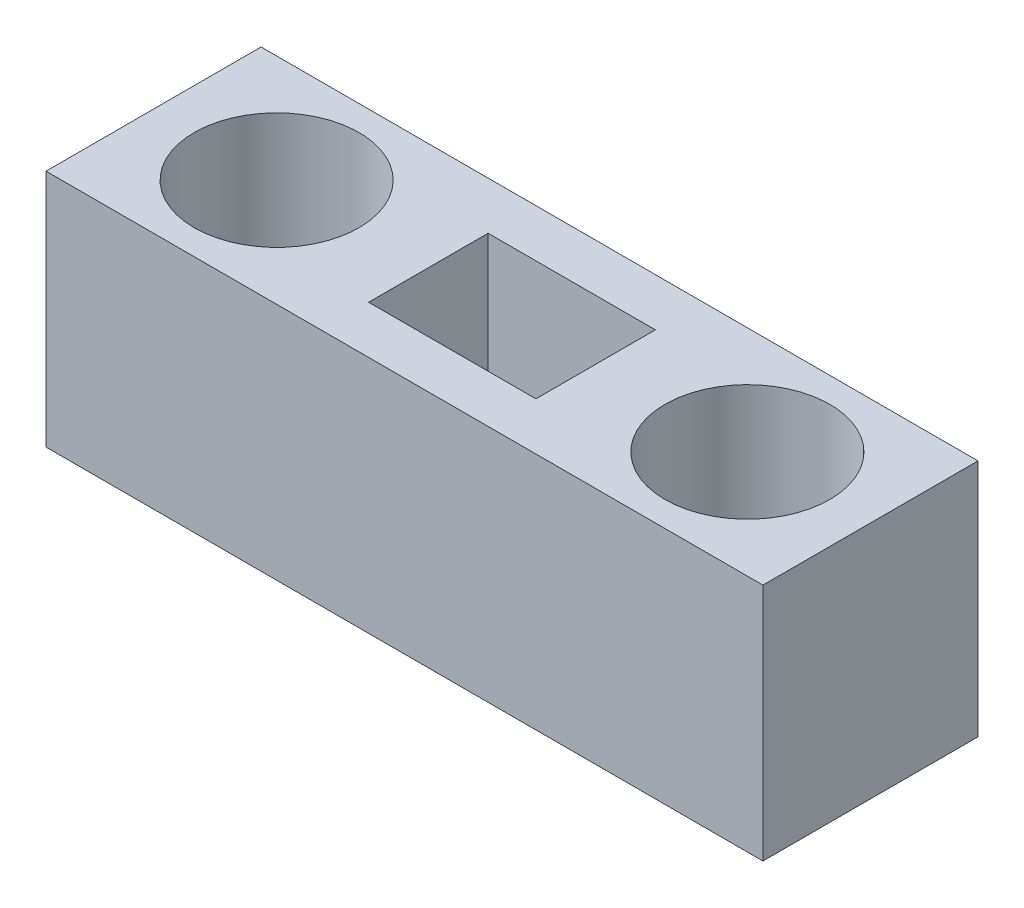
ISO-10303-21;
HEADER;
FILE_DESCRIPTION(('STEP AP214'),'2;1');
FILE_NAME('part.step','',(''),(''),'','','');
FILE_SCHEMA(('AUTOMOTIVE_DESIGN { 1 0 10303 214 1 1 1 1 }'));
ENDSEC;
DATA;
#1=APPLICATION_CONTEXT('core data for automotive mechanical design processes');
#2=APPLICATION_PROTOCOL_DEFINITION('international standard','automotive_design',2000,#1);
#3=PRODUCT_CONTEXT('',#1,'mechanical');
#4=PRODUCT('Part','Part','',(#3));
#5=PRODUCT_RELATED_PRODUCT_CATEGORY('part','',(#4));
#6=PRODUCT_DEFINITION_FORMATION('','',#4);
#7=PRODUCT_DEFINITION_CONTEXT('part definition',#1,'design');
#8=PRODUCT_DEFINITION('design','',#6,#7);
#9=PRODUCT_DEFINITION_SHAPE('','',#8);
#10=(LENGTH_UNIT() NAMED_UNIT(*) SI_UNIT(.MILLI.,.METRE.));
#11=(NAMED_UNIT(*) PLANE_ANGLE_UNIT() SI_UNIT($,.RADIAN.));
#12=(NAMED_UNIT(*) SI_UNIT($,.STERADIAN.) SOLID_ANGLE_UNIT());
#13=UNCERTAINTY_MEASURE_WITH_UNIT(LENGTH_MEASURE(1.E-05),#10,'distance_accuracy_value','');
#14=(GEOMETRIC_REPRESENTATION_CONTEXT(3) GLOBAL_UNCERTAINTY_ASSIGNED_CONTEXT((#13)) GLOBAL_UNIT_ASSIGNED_CONTEXT((#10,
#11,#12)) REPRESENTATION_CONTEXT('',''));
#15=CARTESIAN_POINT('',(0.,0.,0.));
#16=DIRECTION('',(0.,0.,1.));
#17=DIRECTION('',(1.,0.,0.));
#18=AXIS2_PLACEMENT_3D('',#15,#16,#17);
#19=CARTESIAN_POINT('',(0.,10.,0.));
#20=DIRECTION('',(0.,-1.,0.));
#21=DIRECTION('',(0.,0.,-1.));
#22=AXIS2_PLACEMENT_3D('',#19,#20,#21);
#23=PLANE('',#22);
#24=CARTESIAN_POINT('',(9.85,10.,0.));
#25=DIRECTION('',(0.,1.,0.));
#26=DIRECTION('',(0.,0.,1.));
#27=AXIS2_PLACEMENT_3D('',#24,#25,#26);
#28=CIRCLE('',#27,3.45);
#29=CARTESIAN_POINT('',(9.85,10.,3.45));
#30=VERTEX_POINT('',#29);
#31=EDGE_CURVE('E138',#30,#30,#28,.T.);
#32=ORIENTED_EDGE('',*,*,#31,.F.);
#33=EDGE_LOOP('',(#32));
#34=FACE_BOUND('',#33,.T.);
#35=CARTESIAN_POINT('',(-9.85,10.,0.));
#36=DIRECTION('',(0.,1.,0.));
#37=DIRECTION('',(0.,0.,1.));
#38=AXIS2_PLACEMENT_3D('',#35,#36,#37);
#39=CIRCLE('',#38,3.45);
#40=CARTESIAN_POINT('',(-9.85,10.,3.45));
#41=VERTEX_POINT('',#40);
#42=EDGE_CURVE('E144',#41,#41,#39,.T.);
#43=ORIENTED_EDGE('',*,*,#42,.F.);
#44=EDGE_LOOP('',(#43));
#45=FACE_BOUND('',#44,.T.);
#46=DIRECTION('',(0.,0.,-1.));
#47=VECTOR('',#46,1.);
#48=CARTESIAN_POINT('',(15.,10.,4.5));
#49=LINE('',#48,#47);
#50=CARTESIAN_POINT('',(15.,10.,4.5));
#51=VERTEX_POINT('',#50);
#52=CARTESIAN_POINT('',(15.,10.,-4.5));
#53=VERTEX_POINT('',#52);
#54=EDGE_CURVE('E150',#51,#53,#49,.T.);
#55=ORIENTED_EDGE('',*,*,#54,.T.);
#56=DIRECTION('',(-1.,0.,0.));
#57=VECTOR('',#56,1.);
#58=CARTESIAN_POINT('',(-15.,10.,-4.5));
#59=LINE('',#58,#57);
#60=CARTESIAN_POINT('',(-15.,10.,-4.5));
#61=VERTEX_POINT('',#60);
#62=EDGE_CURVE('E153',#53,#61,#59,.T.);
#63=ORIENTED_EDGE('',*,*,#62,.T.);
#64=DIRECTION('',(0.,0.,1.));
#65=VECTOR('',#64,1.);
#66=CARTESIAN_POINT('',(-15.,10.,4.5));
#67=LINE('',#66,#65);
#68=CARTESIAN_POINT('',(-15.,10.,4.5));
#69=VERTEX_POINT('',#68);
#70=EDGE_CURVE('E156',#61,#69,#67,.T.);
#71=ORIENTED_EDGE('',*,*,#70,.T.);
#72=DIRECTION('',(1.,0.,0.));
#73=VECTOR('',#72,1.);
#74=CARTESIAN_POINT('',(-15.,10.,4.5));
#75=LINE('',#74,#73);
#76=EDGE_CURVE('E158',#69,#51,#75,.T.);
#77=ORIENTED_EDGE('',*,*,#76,.T.);
#78=EDGE_LOOP('',(#55,#63,#71,#77));
#79=FACE_BOUND('',#78,.T.);
#80=DIRECTION('',(0.,0.,-1.));
#81=VECTOR('',#80,1.);
#82=CARTESIAN_POINT('',(3.5,10.,2.5));
#83=LINE('',#82,#81);
#84=CARTESIAN_POINT('',(3.5,10.,2.5));
#85=VERTEX_POINT('',#84);
#86=CARTESIAN_POINT('',(3.5,10.,-2.5));
#87=VERTEX_POINT('',#86);
#88=EDGE_CURVE('E102',#85,#87,#83,.T.);
#89=ORIENTED_EDGE('',*,*,#88,.F.);
#90=DIRECTION('',(1.,0.,0.));
#91=VECTOR('',#90,1.);
#92=CARTESIAN_POINT('',(-3.5,10.,2.5));
#93=LINE('',#92,#91);
#94=CARTESIAN_POINT('',(-3.5,10.,2.5));
#95=VERTEX_POINT('',#94);
#96=EDGE_CURVE('E124',#95,#85,#93,.T.);
#97=ORIENTED_EDGE('',*,*,#96,.F.);
#98=DIRECTION('',(0.,0.,1.));
#99=VECTOR('',#98,1.);
#100=CARTESIAN_POINT('',(-3.5,10.,2.5));
#101=LINE('',#100,#99);
#102=CARTESIAN_POINT('',(-3.5,10.,-2.5));
#103=VERTEX_POINT('',#102);
#104=EDGE_CURVE('E122',#103,#95,#101,.T.);
#105=ORIENTED_EDGE('',*,*,#104,.F.);
#106=DIRECTION('',(-1.,0.,0.));
#107=VECTOR('',#106,1.);
#108=CARTESIAN_POINT('',(-3.5,10.,-2.5));
#109=LINE('',#108,#107);
#110=EDGE_CURVE('E110',#87,#103,#109,.T.);
#111=ORIENTED_EDGE('',*,*,#110,.F.);
#112=EDGE_LOOP('',(#89,#97,#105,#111));
#113=FACE_BOUND('',#112,.T.);
#114=ADVANCED_FACE('F37',(#34,#45,#79,#113),#23,.F.);
#115=CARTESIAN_POINT('',(0.,0.,0.));
#116=DIRECTION('',(0.,-1.,0.));
#117=DIRECTION('',(0.,0.,-1.));
#118=AXIS2_PLACEMENT_3D('',#115,#116,#117);
#119=PLANE('',#118);
#120=CARTESIAN_POINT('',(-9.85,0.,0.));
#121=DIRECTION('',(0.,1.,0.));
#122=DIRECTION('',(0.,0.,1.));
#123=AXIS2_PLACEMENT_3D('',#120,#121,#122);
#124=CIRCLE('',#123,3.45);
#125=CARTESIAN_POINT('',(-9.85,0.,3.45));
#126=VERTEX_POINT('',#125);
#127=EDGE_CURVE('E141',#126,#126,#124,.T.);
#128=ORIENTED_EDGE('',*,*,#127,.T.);
#129=EDGE_LOOP('',(#128));
#130=FACE_BOUND('',#129,.T.);
#131=DIRECTION('',(0.,0.,-1.));
#132=VECTOR('',#131,1.);
#133=CARTESIAN_POINT('',(15.,0.,4.5));
#134=LINE('',#133,#132);
#135=CARTESIAN_POINT('',(15.,0.,4.5));
#136=VERTEX_POINT('',#135);
#137=CARTESIAN_POINT('',(15.,0.,-4.5));
#138=VERTEX_POINT('',#137);
#139=EDGE_CURVE('E147',#136,#138,#134,.T.);
#140=ORIENTED_EDGE('',*,*,#139,.F.);
#141=DIRECTION('',(1.,0.,0.));
#142=VECTOR('',#141,1.);
#143=CARTESIAN_POINT('',(-15.,0.,4.5));
#144=LINE('',#143,#142);
#145=CARTESIAN_POINT('',(-15.,0.,4.5));
#146=VERTEX_POINT('',#145);
#147=EDGE_CURVE('E154',#146,#136,#144,.T.);
#148=ORIENTED_EDGE('',*,*,#147,.F.);
#149=DIRECTION('',(0.,0.,1.));
#150=VECTOR('',#149,1.);
#151=CARTESIAN_POINT('',(-15.,0.,4.5));
#152=LINE('',#151,#150);
#153=CARTESIAN_POINT('',(-15.,0.,-4.5));
#154=VERTEX_POINT('',#153);
#155=EDGE_CURVE('E165',#154,#146,#152,.T.);
#156=ORIENTED_EDGE('',*,*,#155,.F.);
#157=DIRECTION('',(-1.,0.,0.));
#158=VECTOR('',#157,1.);
#159=CARTESIAN_POINT('',(-15.,0.,-4.5));
#160=LINE('',#159,#158);
#161=EDGE_CURVE('E163',#138,#154,#160,.T.);
#162=ORIENTED_EDGE('',*,*,#161,.F.);
#163=EDGE_LOOP('',(#140,#148,#156,#162));
#164=FACE_BOUND('',#163,.T.);
#165=CARTESIAN_POINT('',(9.85,0.,0.));
#166=DIRECTION('',(0.,1.,0.));
#167=DIRECTION('',(0.,0.,1.));
#168=AXIS2_PLACEMENT_3D('',#165,#166,#167);
#169=CIRCLE('',#168,3.45);
#170=CARTESIAN_POINT('',(9.85,0.,3.45));
#171=VERTEX_POINT('',#170);
#172=EDGE_CURVE('E118',#171,#171,#169,.T.);
#173=ORIENTED_EDGE('',*,*,#172,.T.);
#174=EDGE_LOOP('',(#173));
#175=FACE_BOUND('',#174,.T.);
#176=DIRECTION('',(1.,0.,0.));
#177=VECTOR('',#176,1.);
#178=CARTESIAN_POINT('',(-3.5,0.,2.5));
#179=LINE('',#178,#177);
#180=CARTESIAN_POINT('',(-3.5,0.,2.5));
#181=VERTEX_POINT('',#180);
#182=CARTESIAN_POINT('',(3.5,0.,2.5));
#183=VERTEX_POINT('',#182);
#184=EDGE_CURVE('E111',#181,#183,#179,.T.);
#185=ORIENTED_EDGE('',*,*,#184,.T.);
#186=DIRECTION('',(0.,0.,-1.));
#187=VECTOR('',#186,1.);
#188=CARTESIAN_POINT('',(3.5,0.,2.5));
#189=LINE('',#188,#187);
#190=CARTESIAN_POINT('',(3.5,0.,-2.5));
#191=VERTEX_POINT('',#190);
#192=EDGE_CURVE('E60',#183,#191,#189,.T.);
#193=ORIENTED_EDGE('',*,*,#192,.T.);
#194=DIRECTION('',(-1.,0.,0.));
#195=VECTOR('',#194,1.);
#196=CARTESIAN_POINT('',(-3.5,0.,-2.5));
#197=LINE('',#196,#195);
#198=CARTESIAN_POINT('',(-3.5,0.,-2.5));
#199=VERTEX_POINT('',#198);
#200=EDGE_CURVE('E117',#191,#199,#197,.T.);
#201=ORIENTED_EDGE('',*,*,#200,.T.);
#202=DIRECTION('',(0.,0.,1.));
#203=VECTOR('',#202,1.);
#204=CARTESIAN_POINT('',(-3.5,0.,2.5));
#205=LINE('',#204,#203);
#206=EDGE_CURVE('E130',#199,#181,#205,.T.);
#207=ORIENTED_EDGE('',*,*,#206,.T.);
#208=EDGE_LOOP('',(#185,#193,#201,#207));
#209=FACE_BOUND('',#208,.T.);
#210=ADVANCED_FACE('F183',(#130,#164,#175,#209),#119,.T.);
#211=CARTESIAN_POINT('',(15.,10.,4.5));
#212=DIRECTION('',(-1.,0.,0.));
#213=DIRECTION('',(0.,0.,1.));
#214=AXIS2_PLACEMENT_3D('',#211,#212,#213);
#215=PLANE('',#214);
#216=ORIENTED_EDGE('',*,*,#139,.T.);
#217=DIRECTION('',(0.,-1.,0.));
#218=VECTOR('',#217,1.);
#219=CARTESIAN_POINT('',(15.,10.,-4.5));
#220=LINE('',#219,#218);
#221=EDGE_CURVE('E11',#53,#138,#220,.T.);
#222=ORIENTED_EDGE('',*,*,#221,.F.);
#223=ORIENTED_EDGE('',*,*,#54,.F.);
#224=DIRECTION('',(0.,-1.,0.));
#225=VECTOR('',#224,1.);
#226=CARTESIAN_POINT('',(15.,10.,4.5));
#227=LINE('',#226,#225);
#228=EDGE_CURVE('E160',#51,#136,#227,.T.);
#229=ORIENTED_EDGE('',*,*,#228,.T.);
#230=EDGE_LOOP('',(#216,#222,#223,#229));
#231=FACE_BOUND('',#230,.T.);
#232=ADVANCED_FACE('F39',(#231),#215,.F.);
#233=CARTESIAN_POINT('',(-15.,10.,-4.5));
#234=DIRECTION('',(0.,0.,1.));
#235=DIRECTION('',(1.,0.,0.));
#236=AXIS2_PLACEMENT_3D('',#233,#234,#235);
#237=PLANE('',#236);
#238=ORIENTED_EDGE('',*,*,#161,.T.);
#239=DIRECTION('',(0.,-1.,0.));
#240=VECTOR('',#239,1.);
#241=CARTESIAN_POINT('',(-15.,10.,-4.5));
#242=LINE('',#241,#240);
#243=EDGE_CURVE('E45',#61,#154,#242,.T.);
#244=ORIENTED_EDGE('',*,*,#243,.F.);
#245=ORIENTED_EDGE('',*,*,#62,.F.);
#246=ORIENTED_EDGE('',*,*,#221,.T.);
#247=EDGE_LOOP('',(#238,#244,#245,#246));
#248=FACE_BOUND('',#247,.T.);
#249=ADVANCED_FACE('F193',(#248),#237,.F.);
#250=CARTESIAN_POINT('',(-15.,10.,4.5));
#251=DIRECTION('',(1.,0.,0.));
#252=DIRECTION('',(0.,0.,-1.));
#253=AXIS2_PLACEMENT_3D('',#250,#251,#252);
#254=PLANE('',#253);
#255=ORIENTED_EDGE('',*,*,#155,.T.);
#256=DIRECTION('',(0.,-1.,0.));
#257=VECTOR('',#256,1.);
#258=CARTESIAN_POINT('',(-15.,10.,4.5));
#259=LINE('',#258,#257);
#260=EDGE_CURVE('E170',#69,#146,#259,.T.);
#261=ORIENTED_EDGE('',*,*,#260,.F.);
#262=ORIENTED_EDGE('',*,*,#70,.F.);
#263=ORIENTED_EDGE('',*,*,#243,.T.);
#264=EDGE_LOOP('',(#255,#261,#262,#263));
#265=FACE_BOUND('',#264,.T.);
#266=ADVANCED_FACE('F177',(#265),#254,.F.);
#267=CARTESIAN_POINT('',(-15.,10.,4.5));
#268=DIRECTION('',(0.,0.,-1.));
#269=DIRECTION('',(-1.,0.,0.));
#270=AXIS2_PLACEMENT_3D('',#267,#268,#269);
#271=PLANE('',#270);
#272=ORIENTED_EDGE('',*,*,#147,.T.);
#273=ORIENTED_EDGE('',*,*,#228,.F.);
#274=ORIENTED_EDGE('',*,*,#76,.F.);
#275=ORIENTED_EDGE('',*,*,#260,.T.);
#276=EDGE_LOOP('',(#272,#273,#274,#275));
#277=FACE_BOUND('',#276,.T.);
#278=ADVANCED_FACE('F187',(#277),#271,.F.);
#279=CARTESIAN_POINT('',(-9.85,10.,0.));
#280=DIRECTION('',(0.,-1.,0.));
#281=DIRECTION('',(0.,0.,-1.));
#282=AXIS2_PLACEMENT_3D('',#279,#280,#281);
#283=CYLINDRICAL_SURFACE('',#282,3.45);
#284=ORIENTED_EDGE('',*,*,#42,.T.);
#285=EDGE_LOOP('',(#284));
#286=FACE_BOUND('',#285,.T.);
#287=ORIENTED_EDGE('',*,*,#127,.F.);
#288=EDGE_LOOP('',(#287));
#289=FACE_BOUND('',#288,.T.);
#290=ADVANCED_FACE('F211',(#286,#289),#283,.F.);
#291=CARTESIAN_POINT('',(9.85,10.,0.));
#292=DIRECTION('',(0.,-1.,0.));
#293=DIRECTION('',(0.,0.,-1.));
#294=AXIS2_PLACEMENT_3D('',#291,#292,#293);
#295=CYLINDRICAL_SURFACE('',#294,3.45);
#296=ORIENTED_EDGE('',*,*,#31,.T.);
#297=EDGE_LOOP('',(#296));
#298=FACE_BOUND('',#297,.T.);
#299=ORIENTED_EDGE('',*,*,#172,.F.);
#300=EDGE_LOOP('',(#299));
#301=FACE_BOUND('',#300,.T.);
#302=ADVANCED_FACE('F218',(#298,#301),#295,.F.);
#303=CARTESIAN_POINT('',(3.5,10.,2.5));
#304=DIRECTION('',(-1.,0.,0.));
#305=DIRECTION('',(0.,0.,1.));
#306=AXIS2_PLACEMENT_3D('',#303,#304,#305);
#307=PLANE('',#306);
#308=ORIENTED_EDGE('',*,*,#192,.F.);
#309=DIRECTION('',(0.,-1.,0.));
#310=VECTOR('',#309,1.);
#311=CARTESIAN_POINT('',(3.5,10.,2.5));
#312=LINE('',#311,#310);
#313=EDGE_CURVE('E106',#85,#183,#312,.T.);
#314=ORIENTED_EDGE('',*,*,#313,.F.);
#315=ORIENTED_EDGE('',*,*,#88,.T.);
#316=DIRECTION('',(0.,-1.,0.));
#317=VECTOR('',#316,1.);
#318=CARTESIAN_POINT('',(3.5,10.,-2.5));
#319=LINE('',#318,#317);
#320=EDGE_CURVE('E105',#87,#191,#319,.T.);
#321=ORIENTED_EDGE('',*,*,#320,.T.);
#322=EDGE_LOOP('',(#308,#314,#315,#321));
#323=FACE_BOUND('',#322,.T.);
#324=ADVANCED_FACE('F104',(#323),#307,.T.);
#325=CARTESIAN_POINT('',(-3.5,10.,-2.5));
#326=DIRECTION('',(0.,0.,1.));
#327=DIRECTION('',(1.,0.,0.));
#328=AXIS2_PLACEMENT_3D('',#325,#326,#327);
#329=PLANE('',#328);
#330=ORIENTED_EDGE('',*,*,#200,.F.);
#331=ORIENTED_EDGE('',*,*,#320,.F.);
#332=ORIENTED_EDGE('',*,*,#110,.T.);
#333=DIRECTION('',(0.,-1.,0.));
#334=VECTOR('',#333,1.);
#335=CARTESIAN_POINT('',(-3.5,10.,-2.5));
#336=LINE('',#335,#334);
#337=EDGE_CURVE('E119',#103,#199,#336,.T.);
#338=ORIENTED_EDGE('',*,*,#337,.T.);
#339=EDGE_LOOP('',(#330,#331,#332,#338));
#340=FACE_BOUND('',#339,.T.);
#341=ADVANCED_FACE('F114',(#340),#329,.T.);
#342=CARTESIAN_POINT('',(-3.5,10.,2.5));
#343=DIRECTION('',(1.,0.,0.));
#344=DIRECTION('',(0.,0.,-1.));
#345=AXIS2_PLACEMENT_3D('',#342,#343,#344);
#346=PLANE('',#345);
#347=ORIENTED_EDGE('',*,*,#206,.F.);
#348=ORIENTED_EDGE('',*,*,#337,.F.);
#349=ORIENTED_EDGE('',*,*,#104,.T.);
#350=DIRECTION('',(0.,-1.,0.));
#351=VECTOR('',#350,1.);
#352=CARTESIAN_POINT('',(-3.5,10.,2.5));
#353=LINE('',#352,#351);
#354=EDGE_CURVE('E52',#95,#181,#353,.T.);
#355=ORIENTED_EDGE('',*,*,#354,.T.);
#356=EDGE_LOOP('',(#347,#348,#349,#355));
#357=FACE_BOUND('',#356,.T.);
#358=ADVANCED_FACE('F235',(#357),#346,.T.);
#359=CARTESIAN_POINT('',(-3.5,10.,2.5));
#360=DIRECTION('',(0.,0.,-1.));
#361=DIRECTION('',(-1.,0.,0.));
#362=AXIS2_PLACEMENT_3D('',#359,#360,#361);
#363=PLANE('',#362);
#364=ORIENTED_EDGE('',*,*,#184,.F.);
#365=ORIENTED_EDGE('',*,*,#354,.F.);
#366=ORIENTED_EDGE('',*,*,#96,.T.);
#367=ORIENTED_EDGE('',*,*,#313,.T.);
#368=EDGE_LOOP('',(#364,#365,#366,#367));
#369=FACE_BOUND('',#368,.T.);
#370=ADVANCED_FACE('F238',(#369),#363,.T.);
#371=CLOSED_SHELL('',(#114,#210,#232,#249,#266,#278,#290,#302,#324,#341,#358,#370));
#372=MANIFOLD_SOLID_BREP('B2',#371);
#373=ADVANCED_BREP_SHAPE_REPRESENTATION('',(#18,#372),#14);
#374=SHAPE_DEFINITION_REPRESENTATION(#9,#373);
ENDSEC;
END-ISO-10303-21;
